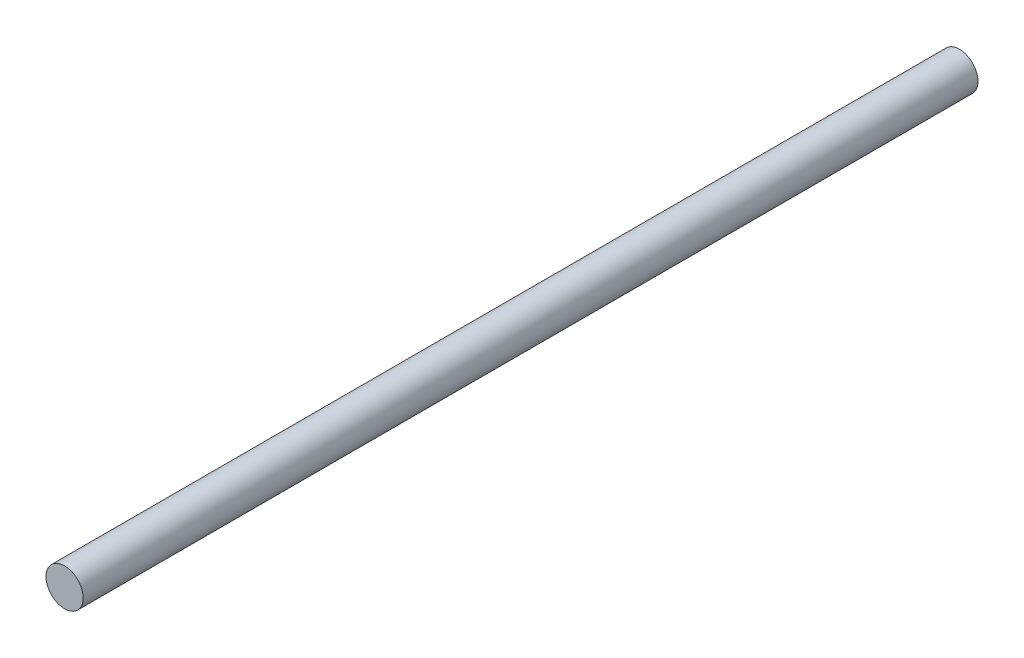
ISO-10303-21;
HEADER;
FILE_DESCRIPTION(('STEP AP214'),'2;1');
FILE_NAME('part.step','',(''),(''),'','','');
FILE_SCHEMA(('AUTOMOTIVE_DESIGN { 1 0 10303 214 1 1 1 1 }'));
ENDSEC;
DATA;
#1=APPLICATION_CONTEXT('core data for automotive mechanical design processes');
#2=APPLICATION_PROTOCOL_DEFINITION('international standard','automotive_design',2000,#1);
#3=PRODUCT_CONTEXT('',#1,'mechanical');
#4=PRODUCT('Part','Part','',(#3));
#5=PRODUCT_RELATED_PRODUCT_CATEGORY('part','',(#4));
#6=PRODUCT_DEFINITION_FORMATION('','',#4);
#7=PRODUCT_DEFINITION_CONTEXT('part definition',#1,'design');
#8=PRODUCT_DEFINITION('design','',#6,#7);
#9=PRODUCT_DEFINITION_SHAPE('','',#8);
#10=(LENGTH_UNIT() NAMED_UNIT(*) SI_UNIT(.MILLI.,.METRE.));
#11=(NAMED_UNIT(*) PLANE_ANGLE_UNIT() SI_UNIT($,.RADIAN.));
#12=(NAMED_UNIT(*) SI_UNIT($,.STERADIAN.) SOLID_ANGLE_UNIT());
#13=UNCERTAINTY_MEASURE_WITH_UNIT(LENGTH_MEASURE(1.E-05),#10,'distance_accuracy_value','');
#14=(GEOMETRIC_REPRESENTATION_CONTEXT(3) GLOBAL_UNCERTAINTY_ASSIGNED_CONTEXT((#13)) GLOBAL_UNIT_ASSIGNED_CONTEXT((#10,
#11,#12)) REPRESENTATION_CONTEXT('',''));
#15=CARTESIAN_POINT('',(0.,0.,0.));
#16=DIRECTION('',(0.,0.,1.));
#17=DIRECTION('',(1.,0.,0.));
#18=AXIS2_PLACEMENT_3D('',#15,#16,#17);
#19=CARTESIAN_POINT('',(0.,0.,450.));
#20=DIRECTION('',(0.,0.,-1.));
#21=DIRECTION('',(-1.,0.,0.));
#22=AXIS2_PLACEMENT_3D('',#19,#20,#21);
#23=CYLINDRICAL_SURFACE('',#22,9.35);
#24=CARTESIAN_POINT('',(0.,0.,450.));
#25=DIRECTION('',(0.,0.,1.));
#26=DIRECTION('',(1.,0.,0.));
#27=AXIS2_PLACEMENT_3D('',#24,#25,#26);
#28=CIRCLE('',#27,9.35);
#29=CARTESIAN_POINT('',(9.35,0.,450.));
#30=VERTEX_POINT('',#29);
#31=EDGE_CURVE('E10',#30,#30,#28,.T.);
#32=ORIENTED_EDGE('',*,*,#31,.F.);
#33=EDGE_LOOP('',(#32));
#34=FACE_BOUND('',#33,.T.);
#35=CARTESIAN_POINT('',(0.,0.,0.));
#36=DIRECTION('',(0.,0.,1.));
#37=DIRECTION('',(1.,0.,0.));
#38=AXIS2_PLACEMENT_3D('',#35,#36,#37);
#39=CIRCLE('',#38,9.35);
#40=CARTESIAN_POINT('',(9.35,0.,0.));
#41=VERTEX_POINT('',#40);
#42=EDGE_CURVE('E40',#41,#41,#39,.T.);
#43=ORIENTED_EDGE('',*,*,#42,.T.);
#44=EDGE_LOOP('',(#43));
#45=FACE_BOUND('',#44,.T.);
#46=ADVANCED_FACE('F37',(#34,#45),#23,.T.);
#47=CARTESIAN_POINT('',(0.,0.,450.));
#48=DIRECTION('',(0.,0.,1.));
#49=DIRECTION('',(1.,0.,0.));
#50=AXIS2_PLACEMENT_3D('',#47,#48,#49);
#51=PLANE('',#50);
#52=ORIENTED_EDGE('',*,*,#31,.T.);
#53=EDGE_LOOP('',(#52));
#54=FACE_BOUND('',#53,.T.);
#55=ADVANCED_FACE('F54',(#54),#51,.T.);
#56=CARTESIAN_POINT('',(0.,0.,0.));
#57=DIRECTION('',(0.,0.,1.));
#58=DIRECTION('',(1.,0.,0.));
#59=AXIS2_PLACEMENT_3D('',#56,#57,#58);
#60=PLANE('',#59);
#61=ORIENTED_EDGE('',*,*,#42,.F.);
#62=EDGE_LOOP('',(#61));
#63=FACE_BOUND('',#62,.T.);
#64=ADVANCED_FACE('F52',(#63),#60,.F.);
#65=CLOSED_SHELL('',(#46,#55,#64));
#66=MANIFOLD_SOLID_BREP('B2',#65);
#67=ADVANCED_BREP_SHAPE_REPRESENTATION('',(#18,#66),#14);
#68=SHAPE_DEFINITION_REPRESENTATION(#9,#67);
ENDSEC;
END-ISO-10303-21;
